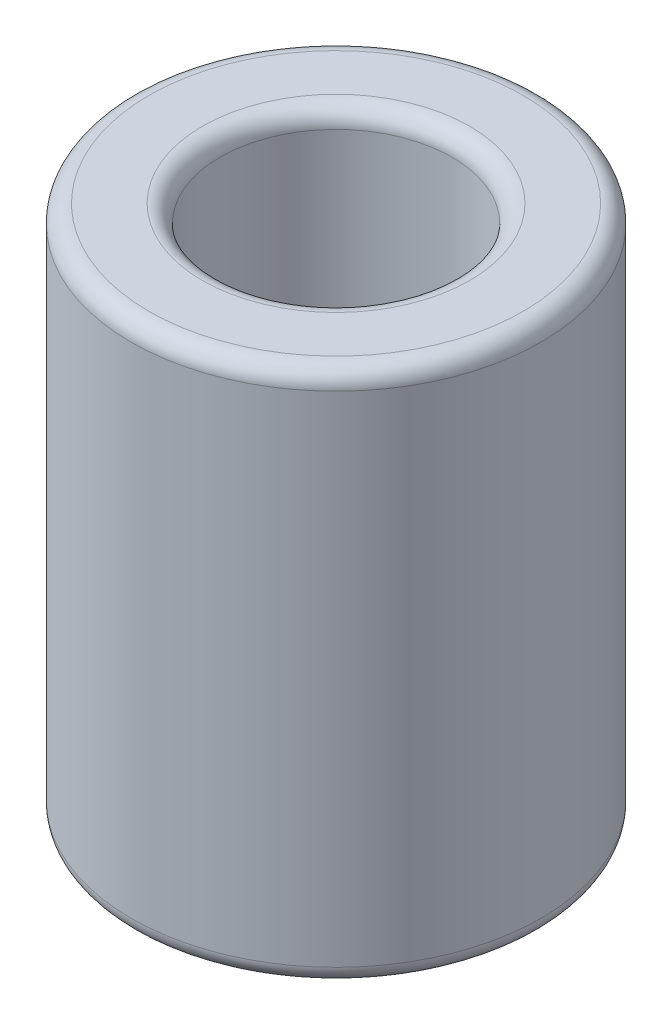
ISO-10303-21;
HEADER;
FILE_DESCRIPTION(('STEP AP214'),'2;1');
FILE_NAME('part.step','',(''),(''),'','','');
FILE_SCHEMA(('AUTOMOTIVE_DESIGN { 1 0 10303 214 1 1 1 1 }'));
ENDSEC;
DATA;
#1=APPLICATION_CONTEXT('core data for automotive mechanical design processes');
#2=APPLICATION_PROTOCOL_DEFINITION('international standard','automotive_design',2000,#1);
#3=PRODUCT_CONTEXT('',#1,'mechanical');
#4=PRODUCT('Part','Part','',(#3));
#5=PRODUCT_RELATED_PRODUCT_CATEGORY('part','',(#4));
#6=PRODUCT_DEFINITION_FORMATION('','',#4);
#7=PRODUCT_DEFINITION_CONTEXT('part definition',#1,'design');
#8=PRODUCT_DEFINITION('design','',#6,#7);
#9=PRODUCT_DEFINITION_SHAPE('','',#8);
#10=(LENGTH_UNIT() NAMED_UNIT(*) SI_UNIT(.MILLI.,.METRE.));
#11=(NAMED_UNIT(*) PLANE_ANGLE_UNIT() SI_UNIT($,.RADIAN.));
#12=(NAMED_UNIT(*) SI_UNIT($,.STERADIAN.) SOLID_ANGLE_UNIT());
#13=UNCERTAINTY_MEASURE_WITH_UNIT(LENGTH_MEASURE(1.E-05),#10,'distance_accuracy_value','');
#14=(GEOMETRIC_REPRESENTATION_CONTEXT(3) GLOBAL_UNCERTAINTY_ASSIGNED_CONTEXT((#13)) GLOBAL_UNIT_ASSIGNED_CONTEXT((#10,
#11,#12)) REPRESENTATION_CONTEXT('',''));
#15=CARTESIAN_POINT('',(0.,0.,0.));
#16=DIRECTION('',(0.,0.,1.));
#17=DIRECTION('',(1.,0.,0.));
#18=AXIS2_PLACEMENT_3D('',#15,#16,#17);
#19=CARTESIAN_POINT('',(0.,30.,0.));
#20=DIRECTION('',(0.,-1.,0.));
#21=DIRECTION('',(0.,0.,-1.));
#22=AXIS2_PLACEMENT_3D('',#19,#20,#21);
#23=CYLINDRICAL_SURFACE('',#22,11.5);
#24=CARTESIAN_POINT('',(0.,1.,0.));
#25=DIRECTION('',(0.,1.,0.));
#26=DIRECTION('',(0.,0.,1.));
#27=AXIS2_PLACEMENT_3D('',#24,#25,#26);
#28=CIRCLE('',#27,11.5);
#29=CARTESIAN_POINT('',(0.,1.,11.5));
#30=VERTEX_POINT('',#29);
#31=EDGE_CURVE('E42',#30,#30,#28,.T.);
#32=ORIENTED_EDGE('',*,*,#31,.T.);
#33=EDGE_LOOP('',(#32));
#34=FACE_BOUND('',#33,.T.);
#35=CARTESIAN_POINT('',(0.,29.,0.));
#36=DIRECTION('',(0.,1.,0.));
#37=DIRECTION('',(0.,0.,1.));
#38=AXIS2_PLACEMENT_3D('',#35,#36,#37);
#39=CIRCLE('',#38,11.5);
#40=CARTESIAN_POINT('',(0.,29.,11.5));
#41=VERTEX_POINT('',#40);
#42=EDGE_CURVE('E46',#41,#41,#39,.F.);
#43=ORIENTED_EDGE('',*,*,#42,.T.);
#44=EDGE_LOOP('',(#43));
#45=FACE_BOUND('',#44,.T.);
#46=ADVANCED_FACE('F31',(#34,#45),#23,.T.);
#47=CARTESIAN_POINT('',(0.,30.,0.));
#48=DIRECTION('',(0.,1.,0.));
#49=DIRECTION('',(0.,0.,1.));
#50=AXIS2_PLACEMENT_3D('',#47,#48,#49);
#51=PLANE('',#50);
#52=CARTESIAN_POINT('',(0.,30.,0.));
#53=DIRECTION('',(0.,1.,0.));
#54=DIRECTION('',(0.,0.,1.));
#55=AXIS2_PLACEMENT_3D('',#52,#53,#54);
#56=CIRCLE('',#55,7.5);
#57=CARTESIAN_POINT('',(0.,30.,7.5));
#58=VERTEX_POINT('',#57);
#59=EDGE_CURVE('E10',#58,#58,#56,.F.);
#60=ORIENTED_EDGE('',*,*,#59,.T.);
#61=EDGE_LOOP('',(#60));
#62=FACE_BOUND('',#61,.T.);
#63=CARTESIAN_POINT('',(0.,30.,0.));
#64=DIRECTION('',(0.,1.,0.));
#65=DIRECTION('',(0.,0.,1.));
#66=AXIS2_PLACEMENT_3D('',#63,#64,#65);
#67=CIRCLE('',#66,10.5);
#68=CARTESIAN_POINT('',(0.,30.,10.5));
#69=VERTEX_POINT('',#68);
#70=EDGE_CURVE('E38',#69,#69,#67,.T.);
#71=ORIENTED_EDGE('',*,*,#70,.T.);
#72=EDGE_LOOP('',(#71));
#73=FACE_BOUND('',#72,.T.);
#74=ADVANCED_FACE('F76',(#62,#73),#51,.T.);
#75=CARTESIAN_POINT('',(0.,0.,0.));
#76=DIRECTION('',(0.,1.,0.));
#77=DIRECTION('',(0.,0.,1.));
#78=AXIS2_PLACEMENT_3D('',#75,#76,#77);
#79=PLANE('',#78);
#80=CARTESIAN_POINT('',(0.,0.,0.));
#81=DIRECTION('',(0.,1.,0.));
#82=DIRECTION('',(0.,0.,1.));
#83=AXIS2_PLACEMENT_3D('',#80,#81,#82);
#84=CIRCLE('',#83,7.5);
#85=CARTESIAN_POINT('',(0.,0.,7.5));
#86=VERTEX_POINT('',#85);
#87=EDGE_CURVE('E57',#86,#86,#84,.T.);
#88=ORIENTED_EDGE('',*,*,#87,.T.);
#89=EDGE_LOOP('',(#88));
#90=FACE_BOUND('',#89,.T.);
#91=CARTESIAN_POINT('',(0.,0.,0.));
#92=DIRECTION('',(0.,1.,0.));
#93=DIRECTION('',(0.,0.,1.));
#94=AXIS2_PLACEMENT_3D('',#91,#92,#93);
#95=CIRCLE('',#94,10.5);
#96=CARTESIAN_POINT('',(0.,0.,10.5));
#97=VERTEX_POINT('',#96);
#98=EDGE_CURVE('E60',#97,#97,#95,.F.);
#99=ORIENTED_EDGE('',*,*,#98,.T.);
#100=EDGE_LOOP('',(#99));
#101=FACE_BOUND('',#100,.T.);
#102=ADVANCED_FACE('F64',(#90,#101),#79,.F.);
#103=CARTESIAN_POINT('',(0.,0.,0.));
#104=DIRECTION('',(0.,1.,0.));
#105=DIRECTION('',(0.,0.,1.));
#106=AXIS2_PLACEMENT_3D('',#103,#104,#105);
#107=CYLINDRICAL_SURFACE('',#106,6.5);
#108=CARTESIAN_POINT('',(0.,1.,0.));
#109=DIRECTION('',(0.,1.,0.));
#110=DIRECTION('',(0.,0.,1.));
#111=AXIS2_PLACEMENT_3D('',#108,#109,#110);
#112=CIRCLE('',#111,6.5);
#113=CARTESIAN_POINT('',(0.,1.,6.5));
#114=VERTEX_POINT('',#113);
#115=EDGE_CURVE('E51',#114,#114,#112,.F.);
#116=ORIENTED_EDGE('',*,*,#115,.T.);
#117=EDGE_LOOP('',(#116));
#118=FACE_BOUND('',#117,.T.);
#119=CARTESIAN_POINT('',(0.,29.,0.));
#120=DIRECTION('',(0.,1.,0.));
#121=DIRECTION('',(0.,0.,1.));
#122=AXIS2_PLACEMENT_3D('',#119,#120,#121);
#123=CIRCLE('',#122,6.5);
#124=CARTESIAN_POINT('',(0.,29.,6.5));
#125=VERTEX_POINT('',#124);
#126=EDGE_CURVE('E54',#125,#125,#123,.T.);
#127=ORIENTED_EDGE('',*,*,#126,.T.);
#128=EDGE_LOOP('',(#127));
#129=FACE_BOUND('',#128,.T.);
#130=ADVANCED_FACE('F91',(#118,#129),#107,.F.);
#131=CARTESIAN_POINT('',(0.,1.,0.));
#132=DIRECTION('',(0.,1.,0.));
#133=DIRECTION('',(0.,0.,1.));
#134=AXIS2_PLACEMENT_3D('',#131,#132,#133);
#135=TOROIDAL_SURFACE('',#134,7.5,1.);
#136=ORIENTED_EDGE('',*,*,#115,.F.);
#137=EDGE_LOOP('',(#136));
#138=FACE_BOUND('',#137,.T.);
#139=ORIENTED_EDGE('',*,*,#87,.F.);
#140=EDGE_LOOP('',(#139));
#141=FACE_BOUND('',#140,.T.);
#142=ADVANCED_FACE('F70',(#138,#141),#135,.T.);
#143=CARTESIAN_POINT('',(0.,1.,0.));
#144=DIRECTION('',(0.,1.,0.));
#145=DIRECTION('',(0.,0.,1.));
#146=AXIS2_PLACEMENT_3D('',#143,#144,#145);
#147=TOROIDAL_SURFACE('',#146,10.5,1.);
#148=ORIENTED_EDGE('',*,*,#98,.F.);
#149=EDGE_LOOP('',(#148));
#150=FACE_BOUND('',#149,.T.);
#151=ORIENTED_EDGE('',*,*,#31,.F.);
#152=EDGE_LOOP('',(#151));
#153=FACE_BOUND('',#152,.T.);
#154=ADVANCED_FACE('F66',(#150,#153),#147,.T.);
#155=CARTESIAN_POINT('',(0.,29.,0.));
#156=DIRECTION('',(0.,1.,0.));
#157=DIRECTION('',(0.,0.,1.));
#158=AXIS2_PLACEMENT_3D('',#155,#156,#157);
#159=TOROIDAL_SURFACE('',#158,7.5,1.);
#160=ORIENTED_EDGE('',*,*,#59,.F.);
#161=EDGE_LOOP('',(#160));
#162=FACE_BOUND('',#161,.T.);
#163=ORIENTED_EDGE('',*,*,#126,.F.);
#164=EDGE_LOOP('',(#163));
#165=FACE_BOUND('',#164,.T.);
#166=ADVANCED_FACE('F69',(#162,#165),#159,.T.);
#167=CARTESIAN_POINT('',(0.,29.,0.));
#168=DIRECTION('',(0.,1.,0.));
#169=DIRECTION('',(0.,0.,1.));
#170=AXIS2_PLACEMENT_3D('',#167,#168,#169);
#171=TOROIDAL_SURFACE('',#170,10.5,1.);
#172=ORIENTED_EDGE('',*,*,#42,.F.);
#173=EDGE_LOOP('',(#172));
#174=FACE_BOUND('',#173,.T.);
#175=ORIENTED_EDGE('',*,*,#70,.F.);
#176=EDGE_LOOP('',(#175));
#177=FACE_BOUND('',#176,.T.);
#178=ADVANCED_FACE('F33',(#174,#177),#171,.T.);
#179=CLOSED_SHELL('',(#46,#74,#102,#130,#142,#154,#166,#178));
#180=MANIFOLD_SOLID_BREP('B2',#179);
#181=ADVANCED_BREP_SHAPE_REPRESENTATION('',(#18,#180),#14);
#182=SHAPE_DEFINITION_REPRESENTATION(#9,#181);
ENDSEC;
END-ISO-10303-21;
